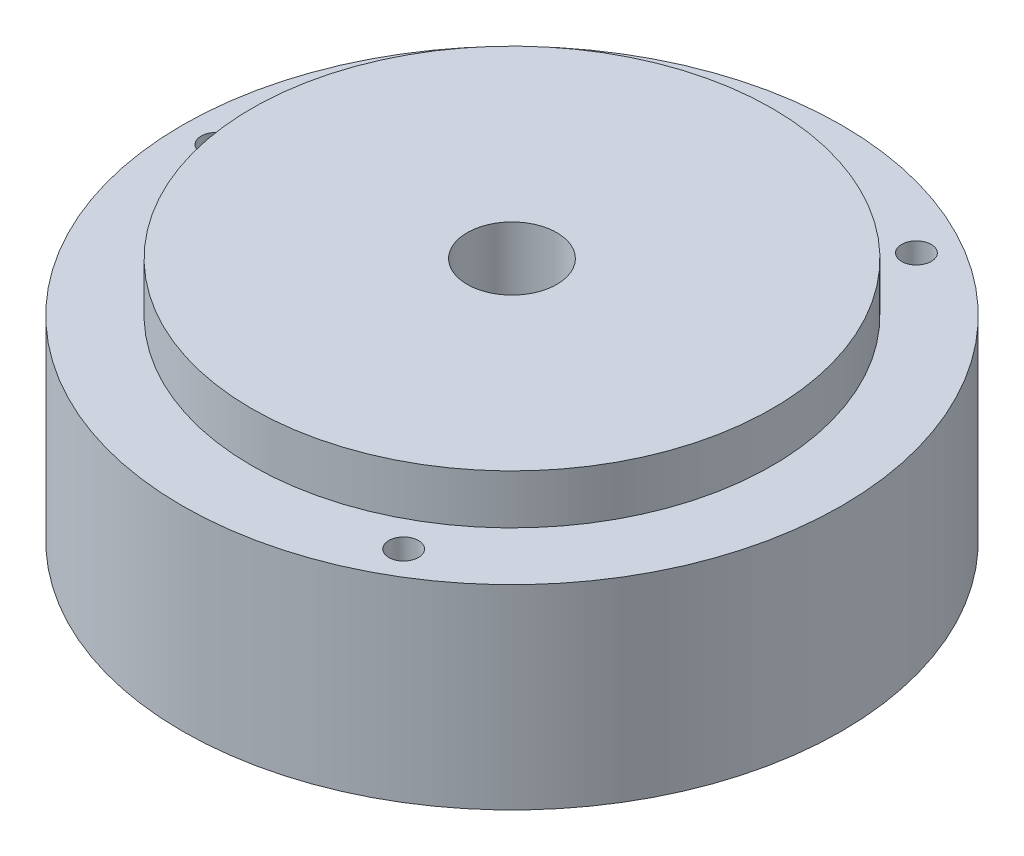
ISO-10303-21;
HEADER;
FILE_DESCRIPTION(('STEP AP214'),'2;1');
FILE_NAME('part.step','',(''),(''),'','','');
FILE_SCHEMA(('AUTOMOTIVE_DESIGN { 1 0 10303 214 1 1 1 1 }'));
ENDSEC;
DATA;
#1=APPLICATION_CONTEXT('core data for automotive mechanical design processes');
#2=APPLICATION_PROTOCOL_DEFINITION('international standard','automotive_design',2000,#1);
#3=PRODUCT_CONTEXT('',#1,'mechanical');
#4=PRODUCT('Part','Part','',(#3));
#5=PRODUCT_RELATED_PRODUCT_CATEGORY('part','',(#4));
#6=PRODUCT_DEFINITION_FORMATION('','',#4);
#7=PRODUCT_DEFINITION_CONTEXT('part definition',#1,'design');
#8=PRODUCT_DEFINITION('design','',#6,#7);
#9=PRODUCT_DEFINITION_SHAPE('','',#8);
#10=(LENGTH_UNIT() NAMED_UNIT(*) SI_UNIT(.MILLI.,.METRE.));
#11=(NAMED_UNIT(*) PLANE_ANGLE_UNIT() SI_UNIT($,.RADIAN.));
#12=(NAMED_UNIT(*) SI_UNIT($,.STERADIAN.) SOLID_ANGLE_UNIT());
#13=UNCERTAINTY_MEASURE_WITH_UNIT(LENGTH_MEASURE(1.E-05),#10,'distance_accuracy_value','');
#14=(GEOMETRIC_REPRESENTATION_CONTEXT(3) GLOBAL_UNCERTAINTY_ASSIGNED_CONTEXT((#13)) GLOBAL_UNIT_ASSIGNED_CONTEXT((#10,
#11,#12)) REPRESENTATION_CONTEXT('',''));
#15=CARTESIAN_POINT('',(0.,0.,0.));
#16=DIRECTION('',(0.,0.,1.));
#17=DIRECTION('',(1.,0.,0.));
#18=AXIS2_PLACEMENT_3D('',#15,#16,#17);
#19=CARTESIAN_POINT('',(0.,49.6219135802469,0.));
#20=DIRECTION('',(0.,1.,0.));
#21=DIRECTION('',(0.,0.,1.));
#22=AXIS2_PLACEMENT_3D('',#19,#20,#21);
#23=CYLINDRICAL_SURFACE('',#22,46.204826629932);
#24=CARTESIAN_POINT('',(0.,-19.2670480749446,0.));
#25=DIRECTION('',(0.,1.,0.));
#26=DIRECTION('',(0.,0.,1.));
#27=AXIS2_PLACEMENT_3D('',#24,#25,#26);
#28=CIRCLE('',#27,46.204826629932);
#29=CARTESIAN_POINT('',(45.8289575186259,-19.2670480749446,-5.88155223202639));
#30=VERTEX_POINT('',#29);
#31=CARTESIAN_POINT('',(5.86328891155574,-19.2670480749446,-45.8312976800973));
#32=VERTEX_POINT('',#31);
#33=EDGE_CURVE('E287',#30,#32,#28,.T.);
#34=ORIENTED_EDGE('',*,*,#33,.F.);
#35=DIRECTION('',(0.,1.,0.));
#36=VECTOR('',#35,1.);
#37=CARTESIAN_POINT('',(45.8289575186259,49.6219135802469,-5.88155223202639));
#38=LINE('',#37,#36);
#39=CARTESIAN_POINT('',(45.8289575186259,-29.7670480749446,-5.88155223202639));
#40=VERTEX_POINT('',#39);
#41=EDGE_CURVE('E153',#30,#40,#38,.F.);
#42=ORIENTED_EDGE('',*,*,#41,.T.);
#43=CARTESIAN_POINT('',(0.,-29.7670480749446,0.));
#44=DIRECTION('',(0.,1.,0.));
#45=DIRECTION('',(0.,0.,1.));
#46=AXIS2_PLACEMENT_3D('',#43,#44,#45);
#47=CIRCLE('',#46,46.204826629932);
#48=CARTESIAN_POINT('',(5.86328891155574,-29.7670480749446,-45.8312976800974));
#49=VERTEX_POINT('',#48);
#50=EDGE_CURVE('E293',#40,#49,#47,.T.);
#51=ORIENTED_EDGE('',*,*,#50,.T.);
#52=DIRECTION('',(0.,1.,0.));
#53=VECTOR('',#52,1.);
#54=CARTESIAN_POINT('',(5.86328891155574,49.6219135802469,-45.8312976800974));
#55=LINE('',#54,#53);
#56=EDGE_CURVE('E311',#49,#32,#55,.T.);
#57=ORIENTED_EDGE('',*,*,#56,.T.);
#58=EDGE_LOOP('',(#34,#42,#51,#57));
#59=FACE_BOUND('',#58,.T.);
#60=ADVANCED_FACE('F36',(#59),#23,.T.);
#61=CARTESIAN_POINT('',(5.88155223202623,-29.7670480749446,45.8289575186259));
#62=VERTEX_POINT('',#61);
#63=CARTESIAN_POINT('',(45.8312976800974,-29.7670480749446,5.86328891155526));
#64=VERTEX_POINT('',#63);
#65=EDGE_CURVE('E343',#62,#64,#47,.T.);
#66=ORIENTED_EDGE('',*,*,#65,.T.);
#67=DIRECTION('',(0.,1.,0.));
#68=VECTOR('',#67,1.);
#69=CARTESIAN_POINT('',(45.8312976800974,49.6219135802469,5.86328891155526));
#70=LINE('',#69,#68);
#71=CARTESIAN_POINT('',(45.8312976800974,-19.2670480749446,5.86328891155526));
#72=VERTEX_POINT('',#71);
#73=EDGE_CURVE('E51',#64,#72,#70,.T.);
#74=ORIENTED_EDGE('',*,*,#73,.T.);
#75=CARTESIAN_POINT('',(5.88155223202623,-19.2670480749446,45.8289575186259));
#76=VERTEX_POINT('',#75);
#77=EDGE_CURVE('E362',#76,#72,#28,.T.);
#78=ORIENTED_EDGE('',*,*,#77,.F.);
#79=DIRECTION('',(0.,1.,0.));
#80=VECTOR('',#79,1.);
#81=CARTESIAN_POINT('',(5.88155223202623,49.6219135802469,45.8289575186259));
#82=LINE('',#81,#80);
#83=EDGE_CURVE('E200',#76,#62,#82,.F.);
#84=ORIENTED_EDGE('',*,*,#83,.T.);
#85=EDGE_LOOP('',(#66,#74,#78,#84));
#86=FACE_BOUND('',#85,.T.);
#87=ADVANCED_FACE('F392',(#86),#23,.T.);
#88=CARTESIAN_POINT('',(-45.8289575186259,-29.7670480749446,5.88155223202607));
#89=VERTEX_POINT('',#88);
#90=CARTESIAN_POINT('',(-5.86328891155543,-29.7670480749446,45.8312976800974));
#91=VERTEX_POINT('',#90);
#92=EDGE_CURVE('E299',#89,#91,#47,.T.);
#93=ORIENTED_EDGE('',*,*,#92,.T.);
#94=DIRECTION('',(0.,1.,0.));
#95=VECTOR('',#94,1.);
#96=CARTESIAN_POINT('',(-5.86328891155542,49.6219135802469,45.8312976800974));
#97=LINE('',#96,#95);
#98=CARTESIAN_POINT('',(-5.86328891155542,-19.2670480749446,45.8312976800974));
#99=VERTEX_POINT('',#98);
#100=EDGE_CURVE('E58',#91,#99,#97,.T.);
#101=ORIENTED_EDGE('',*,*,#100,.T.);
#102=CARTESIAN_POINT('',(-45.8289575186259,-19.2670480749446,5.88155223202607));
#103=VERTEX_POINT('',#102);
#104=EDGE_CURVE('E294',#103,#99,#28,.T.);
#105=ORIENTED_EDGE('',*,*,#104,.F.);
#106=DIRECTION('',(0.,1.,0.));
#107=VECTOR('',#106,1.);
#108=CARTESIAN_POINT('',(-45.8289575186259,49.6219135802469,5.88155223202607));
#109=LINE('',#108,#107);
#110=EDGE_CURVE('E328',#103,#89,#109,.F.);
#111=ORIENTED_EDGE('',*,*,#110,.T.);
#112=EDGE_LOOP('',(#93,#101,#105,#111));
#113=FACE_BOUND('',#112,.T.);
#114=ADVANCED_FACE('F340',(#113),#23,.T.);
#115=CARTESIAN_POINT('',(73.5,-19.2670480749446,0.));
#116=DIRECTION('',(0.,1.,0.));
#117=DIRECTION('',(0.,0.,1.));
#118=AXIS2_PLACEMENT_3D('',#115,#116,#117);
#119=PLANE('',#118);
#120=ORIENTED_EDGE('',*,*,#77,.T.);
#121=DIRECTION('',(-1.,0.,0.));
#122=VECTOR('',#121,1.);
#123=CARTESIAN_POINT('',(46.2234515561875,-19.2670480749446,5.86328891155526));
#124=LINE('',#123,#122);
#125=CARTESIAN_POINT('',(41.0700452865314,-19.2670480749446,5.86328891155531));
#126=VERTEX_POINT('',#125);
#127=EDGE_CURVE('E157',#72,#126,#124,.T.);
#128=ORIENTED_EDGE('',*,*,#127,.T.);
#129=DIRECTION('',(0.,0.,-1.));
#130=VECTOR('',#129,1.);
#131=CARTESIAN_POINT('',(41.0700452865314,-19.2670480749446,5.86328891155531));
#132=LINE('',#131,#130);
#133=CARTESIAN_POINT('',(41.0700452865313,-19.2670480749446,-5.88155223202634));
#134=VERTEX_POINT('',#133);
#135=EDGE_CURVE('E163',#126,#134,#132,.T.);
#136=ORIENTED_EDGE('',*,*,#135,.T.);
#137=DIRECTION('',(1.,0.,0.));
#138=VECTOR('',#137,1.);
#139=CARTESIAN_POINT('',(46.2234515561874,-19.2670480749446,-5.88155223202639));
#140=LINE('',#139,#138);
#141=EDGE_CURVE('E147',#134,#30,#140,.T.);
#142=ORIENTED_EDGE('',*,*,#141,.T.);
#143=ORIENTED_EDGE('',*,*,#33,.T.);
#144=DIRECTION('',(0.,0.,1.));
#145=VECTOR('',#144,1.);
#146=CARTESIAN_POINT('',(5.86328891155574,-19.2670480749446,-46.2234515561875));
#147=LINE('',#146,#145);
#148=CARTESIAN_POINT('',(5.86328891155574,-19.2670480749446,-41.0700452865314));
#149=VERTEX_POINT('',#148);
#150=EDGE_CURVE('E234',#32,#149,#147,.T.);
#151=ORIENTED_EDGE('',*,*,#150,.T.);
#152=DIRECTION('',(-1.,0.,0.));
#153=VECTOR('',#152,1.);
#154=CARTESIAN_POINT('',(5.86328891155574,-19.2670480749446,-41.0700452865314));
#155=LINE('',#154,#153);
#156=CARTESIAN_POINT('',(-5.88155223202591,-19.2670480749446,-41.0700452865314));
#157=VERTEX_POINT('',#156);
#158=EDGE_CURVE('E226',#149,#157,#155,.T.);
#159=ORIENTED_EDGE('',*,*,#158,.T.);
#160=DIRECTION('',(0.,0.,-1.));
#161=VECTOR('',#160,1.);
#162=CARTESIAN_POINT('',(-5.88155223202591,-19.2670480749446,-46.2234515561875));
#163=LINE('',#162,#161);
#164=CARTESIAN_POINT('',(-5.88155223202591,-19.2670480749446,-45.8289575186259));
#165=VERTEX_POINT('',#164);
#166=EDGE_CURVE('E237',#157,#165,#163,.T.);
#167=ORIENTED_EDGE('',*,*,#166,.T.);
#168=CARTESIAN_POINT('',(-45.8312976800974,-19.2670480749446,-5.86328891155558));
#169=VERTEX_POINT('',#168);
#170=EDGE_CURVE('E290',#165,#169,#28,.T.);
#171=ORIENTED_EDGE('',*,*,#170,.T.);
#172=DIRECTION('',(1.,0.,0.));
#173=VECTOR('',#172,1.);
#174=CARTESIAN_POINT('',(-46.2234515561875,-19.2670480749446,-5.86328891155558));
#175=LINE('',#174,#173);
#176=CARTESIAN_POINT('',(-41.0700452865314,-19.2670480749446,-5.8632889115556));
#177=VERTEX_POINT('',#176);
#178=EDGE_CURVE('E214',#169,#177,#175,.T.);
#179=ORIENTED_EDGE('',*,*,#178,.T.);
#180=DIRECTION('',(0.,0.,1.));
#181=VECTOR('',#180,1.);
#182=CARTESIAN_POINT('',(-41.0700452865314,-19.2670480749446,-5.8632889115556));
#183=LINE('',#182,#181);
#184=CARTESIAN_POINT('',(-41.0700452865313,-19.2670480749446,5.88155223202605));
#185=VERTEX_POINT('',#184);
#186=EDGE_CURVE('E206',#177,#185,#183,.T.);
#187=ORIENTED_EDGE('',*,*,#186,.T.);
#188=DIRECTION('',(-1.,0.,0.));
#189=VECTOR('',#188,1.);
#190=CARTESIAN_POINT('',(-46.2234515561874,-19.2670480749446,5.88155223202607));
#191=LINE('',#190,#189);
#192=EDGE_CURVE('E217',#185,#103,#191,.T.);
#193=ORIENTED_EDGE('',*,*,#192,.T.);
#194=ORIENTED_EDGE('',*,*,#104,.T.);
#195=DIRECTION('',(0.,0.,-1.));
#196=VECTOR('',#195,1.);
#197=CARTESIAN_POINT('',(-5.86328891155542,-19.2670480749446,46.2234515561875));
#198=LINE('',#197,#196);
#199=CARTESIAN_POINT('',(-5.86328891155545,-19.2670480749446,41.0700452865314));
#200=VERTEX_POINT('',#199);
#201=EDGE_CURVE('E190',#99,#200,#198,.T.);
#202=ORIENTED_EDGE('',*,*,#201,.T.);
#203=DIRECTION('',(1.,0.,0.));
#204=VECTOR('',#203,1.);
#205=CARTESIAN_POINT('',(-5.86328891155545,-19.2670480749446,41.0700452865314));
#206=LINE('',#205,#204);
#207=CARTESIAN_POINT('',(5.8815522320262,-19.2670480749446,41.0700452865313));
#208=VERTEX_POINT('',#207);
#209=EDGE_CURVE('E184',#200,#208,#206,.T.);
#210=ORIENTED_EDGE('',*,*,#209,.T.);
#211=DIRECTION('',(0.,0.,1.));
#212=VECTOR('',#211,1.);
#213=CARTESIAN_POINT('',(5.88155223202623,-19.2670480749446,46.2234515561874));
#214=LINE('',#213,#212);
#215=EDGE_CURVE('E193',#208,#76,#214,.T.);
#216=ORIENTED_EDGE('',*,*,#215,.T.);
#217=EDGE_LOOP('',(#120,#128,#136,#142,#143,#151,#159,#167,#171,#179,#187,#193,#194,#202,#210,#216));
#218=FACE_BOUND('',#217,.T.);
#219=CARTESIAN_POINT('',(-66.,-19.2670480749446,0.));
#220=DIRECTION('',(0.,-1.,0.));
#221=DIRECTION('',(0.,0.,-1.));
#222=AXIS2_PLACEMENT_3D('',#219,#220,#221);
#223=CIRCLE('',#222,6.5);
#224=CARTESIAN_POINT('',(-66.,-19.2670480749446,-6.5));
#225=VERTEX_POINT('',#224);
#226=EDGE_CURVE('E243',#225,#225,#223,.T.);
#227=ORIENTED_EDGE('',*,*,#226,.F.);
#228=EDGE_LOOP('',(#227));
#229=FACE_BOUND('',#228,.T.);
#230=CARTESIAN_POINT('',(33.0000000000003,-19.2670480749446,57.1576766497728));
#231=DIRECTION('',(0.,-1.,0.));
#232=DIRECTION('',(0.,0.,-1.));
#233=AXIS2_PLACEMENT_3D('',#230,#231,#232);
#234=CIRCLE('',#233,6.5);
#235=CARTESIAN_POINT('',(33.0000000000003,-19.2670480749446,50.6576766497728));
#236=VERTEX_POINT('',#235);
#237=EDGE_CURVE('E253',#236,#236,#234,.T.);
#238=ORIENTED_EDGE('',*,*,#237,.F.);
#239=EDGE_LOOP('',(#238));
#240=FACE_BOUND('',#239,.T.);
#241=CARTESIAN_POINT('',(32.9999999999995,-19.2670480749446,-57.1576766497732));
#242=DIRECTION('',(0.,-1.,0.));
#243=DIRECTION('',(0.,0.,-1.));
#244=AXIS2_PLACEMENT_3D('',#241,#242,#243);
#245=CIRCLE('',#244,6.5);
#246=CARTESIAN_POINT('',(32.9999999999995,-19.2670480749446,-63.6576766497732));
#247=VERTEX_POINT('',#246);
#248=EDGE_CURVE('E263',#247,#247,#245,.T.);
#249=ORIENTED_EDGE('',*,*,#248,.F.);
#250=EDGE_LOOP('',(#249));
#251=FACE_BOUND('',#250,.T.);
#252=CARTESIAN_POINT('',(0.,-19.2670480749446,0.));
#253=DIRECTION('',(0.,1.,0.));
#254=DIRECTION('',(0.,0.,1.));
#255=AXIS2_PLACEMENT_3D('',#252,#253,#254);
#256=CIRCLE('',#255,73.5);
#257=CARTESIAN_POINT('',(0.,-19.2670480749446,73.5));
#258=VERTEX_POINT('',#257);
#259=EDGE_CURVE('E308',#258,#258,#256,.T.);
#260=ORIENTED_EDGE('',*,*,#259,.F.);
#261=EDGE_LOOP('',(#260));
#262=FACE_BOUND('',#261,.T.);
#263=ADVANCED_FACE('F38',(#218,#229,#240,#251,#262),#119,.F.);
#264=CARTESIAN_POINT('',(0.,49.6219135802469,0.));
#265=DIRECTION('',(0.,1.,0.));
#266=DIRECTION('',(0.,0.,1.));
#267=AXIS2_PLACEMENT_3D('',#264,#265,#266);
#268=CYLINDRICAL_SURFACE('',#267,73.5);
#269=CARTESIAN_POINT('',(0.,24.2329519250554,0.));
#270=DIRECTION('',(0.,1.,0.));
#271=DIRECTION('',(0.,0.,1.));
#272=AXIS2_PLACEMENT_3D('',#269,#270,#271);
#273=CIRCLE('',#272,73.5);
#274=CARTESIAN_POINT('',(0.,24.2329519250554,73.5));
#275=VERTEX_POINT('',#274);
#276=EDGE_CURVE('E305',#275,#275,#273,.T.);
#277=ORIENTED_EDGE('',*,*,#276,.F.);
#278=EDGE_LOOP('',(#277));
#279=FACE_BOUND('',#278,.T.);
#280=ORIENTED_EDGE('',*,*,#259,.T.);
#281=EDGE_LOOP('',(#280));
#282=FACE_BOUND('',#281,.T.);
#283=ADVANCED_FACE('F413',(#279,#282),#268,.T.);
#284=CARTESIAN_POINT('',(73.5,24.2329519250554,0.));
#285=DIRECTION('',(0.,-1.,0.));
#286=DIRECTION('',(0.,0.,-1.));
#287=AXIS2_PLACEMENT_3D('',#284,#285,#286);
#288=PLANE('',#287);
#289=CARTESIAN_POINT('',(-66.,24.2329519250554,0.));
#290=DIRECTION('',(0.,-1.,0.));
#291=DIRECTION('',(0.,0.,-1.));
#292=AXIS2_PLACEMENT_3D('',#289,#290,#291);
#293=CIRCLE('',#292,3.3);
#294=CARTESIAN_POINT('',(-66.,24.2329519250554,-3.3));
#295=VERTEX_POINT('',#294);
#296=EDGE_CURVE('E252',#295,#295,#293,.T.);
#297=ORIENTED_EDGE('',*,*,#296,.T.);
#298=EDGE_LOOP('',(#297));
#299=FACE_BOUND('',#298,.T.);
#300=CARTESIAN_POINT('',(33.0000000000003,24.2329519250554,57.1576766497728));
#301=DIRECTION('',(0.,-1.,0.));
#302=DIRECTION('',(0.,0.,-1.));
#303=AXIS2_PLACEMENT_3D('',#300,#301,#302);
#304=CIRCLE('',#303,3.29999999999999);
#305=CARTESIAN_POINT('',(33.0000000000003,24.2329519250554,53.8576766497728));
#306=VERTEX_POINT('',#305);
#307=EDGE_CURVE('E262',#306,#306,#304,.T.);
#308=ORIENTED_EDGE('',*,*,#307,.T.);
#309=EDGE_LOOP('',(#308));
#310=FACE_BOUND('',#309,.T.);
#311=CARTESIAN_POINT('',(32.9999999999995,24.2329519250554,-57.1576766497732));
#312=DIRECTION('',(0.,-1.,0.));
#313=DIRECTION('',(0.,0.,-1.));
#314=AXIS2_PLACEMENT_3D('',#311,#312,#313);
#315=CIRCLE('',#314,3.29999999999999);
#316=CARTESIAN_POINT('',(32.9999999999995,24.2329519250554,-60.4576766497732));
#317=VERTEX_POINT('',#316);
#318=EDGE_CURVE('E272',#317,#317,#315,.T.);
#319=ORIENTED_EDGE('',*,*,#318,.T.);
#320=EDGE_LOOP('',(#319));
#321=FACE_BOUND('',#320,.T.);
#322=CARTESIAN_POINT('',(0.,24.2329519250554,0.));
#323=DIRECTION('',(0.,1.,0.));
#324=DIRECTION('',(0.,0.,1.));
#325=AXIS2_PLACEMENT_3D('',#322,#323,#324);
#326=CIRCLE('',#325,58.);
#327=CARTESIAN_POINT('',(0.,24.2329519250554,58.));
#328=VERTEX_POINT('',#327);
#329=EDGE_CURVE('E302',#328,#328,#326,.T.);
#330=ORIENTED_EDGE('',*,*,#329,.F.);
#331=EDGE_LOOP('',(#330));
#332=FACE_BOUND('',#331,.T.);
#333=ORIENTED_EDGE('',*,*,#276,.T.);
#334=EDGE_LOOP('',(#333));
#335=FACE_BOUND('',#334,.T.);
#336=ADVANCED_FACE('F417',(#299,#310,#321,#332,#335),#288,.F.);
#337=CARTESIAN_POINT('',(0.,49.6219135802469,0.));
#338=DIRECTION('',(0.,1.,0.));
#339=DIRECTION('',(0.,0.,1.));
#340=AXIS2_PLACEMENT_3D('',#337,#338,#339);
#341=CYLINDRICAL_SURFACE('',#340,58.);
#342=CARTESIAN_POINT('',(0.,35.2329519250554,0.));
#343=DIRECTION('',(0.,1.,0.));
#344=DIRECTION('',(0.,0.,1.));
#345=AXIS2_PLACEMENT_3D('',#342,#343,#344);
#346=CIRCLE('',#345,58.);
#347=CARTESIAN_POINT('',(0.,35.2329519250554,58.));
#348=VERTEX_POINT('',#347);
#349=EDGE_CURVE('E298',#348,#348,#346,.T.);
#350=ORIENTED_EDGE('',*,*,#349,.F.);
#351=EDGE_LOOP('',(#350));
#352=FACE_BOUND('',#351,.T.);
#353=ORIENTED_EDGE('',*,*,#329,.T.);
#354=EDGE_LOOP('',(#353));
#355=FACE_BOUND('',#354,.T.);
#356=ADVANCED_FACE('F422',(#352,#355),#341,.T.);
#357=CARTESIAN_POINT('',(58.,35.2329519250554,0.));
#358=DIRECTION('',(0.,-1.,0.));
#359=DIRECTION('',(0.,0.,-1.));
#360=AXIS2_PLACEMENT_3D('',#357,#358,#359);
#361=PLANE('',#360);
#362=CARTESIAN_POINT('',(0.,35.2329519250554,0.));
#363=DIRECTION('',(0.,1.,0.));
#364=DIRECTION('',(0.,0.,1.));
#365=AXIS2_PLACEMENT_3D('',#362,#363,#364);
#366=CIRCLE('',#365,10.);
#367=CARTESIAN_POINT('',(0.,35.2329519250554,10.));
#368=VERTEX_POINT('',#367);
#369=EDGE_CURVE('E281',#368,#368,#366,.T.);
#370=ORIENTED_EDGE('',*,*,#369,.F.);
#371=EDGE_LOOP('',(#370));
#372=FACE_BOUND('',#371,.T.);
#373=ORIENTED_EDGE('',*,*,#349,.T.);
#374=EDGE_LOOP('',(#373));
#375=FACE_BOUND('',#374,.T.);
#376=ADVANCED_FACE('F407',(#372,#375),#361,.F.);
#377=CARTESIAN_POINT('',(46.204826629932,-29.7670480749446,0.));
#378=DIRECTION('',(0.,1.,0.));
#379=DIRECTION('',(0.,0.,1.));
#380=AXIS2_PLACEMENT_3D('',#377,#378,#379);
#381=PLANE('',#380);
#382=CARTESIAN_POINT('',(0.,-29.7670480749446,0.));
#383=DIRECTION('',(0.,-1.,0.));
#384=DIRECTION('',(0.,0.,-1.));
#385=AXIS2_PLACEMENT_3D('',#382,#383,#384);
#386=CIRCLE('',#385,20.);
#387=CARTESIAN_POINT('',(0.,-29.7670480749446,-20.));
#388=VERTEX_POINT('',#387);
#389=EDGE_CURVE('E276',#388,#388,#386,.T.);
#390=ORIENTED_EDGE('',*,*,#389,.F.);
#391=EDGE_LOOP('',(#390));
#392=FACE_BOUND('',#391,.T.);
#393=ORIENTED_EDGE('',*,*,#50,.F.);
#394=DIRECTION('',(1.,0.,0.));
#395=VECTOR('',#394,1.);
#396=CARTESIAN_POINT('',(46.2234515561874,-29.7670480749446,-5.88155223202639));
#397=LINE('',#396,#395);
#398=CARTESIAN_POINT('',(41.0700452865313,-29.7670480749446,-5.88155223202634));
#399=VERTEX_POINT('',#398);
#400=EDGE_CURVE('E171',#399,#40,#397,.T.);
#401=ORIENTED_EDGE('',*,*,#400,.F.);
#402=DIRECTION('',(0.,0.,-1.));
#403=VECTOR('',#402,1.);
#404=CARTESIAN_POINT('',(41.0700452865314,-29.7670480749446,5.86328891155531));
#405=LINE('',#404,#403);
#406=CARTESIAN_POINT('',(41.0700452865314,-29.7670480749446,5.86328891155531));
#407=VERTEX_POINT('',#406);
#408=EDGE_CURVE('E166',#407,#399,#405,.T.);
#409=ORIENTED_EDGE('',*,*,#408,.F.);
#410=DIRECTION('',(1.,0.,0.));
#411=VECTOR('',#410,1.);
#412=CARTESIAN_POINT('',(46.204826629932,-29.7670480749446,5.86328891155526));
#413=LINE('',#412,#411);
#414=EDGE_CURVE('E11',#407,#64,#413,.T.);
#415=ORIENTED_EDGE('',*,*,#414,.T.);
#416=ORIENTED_EDGE('',*,*,#65,.F.);
#417=DIRECTION('',(0.,0.,1.));
#418=VECTOR('',#417,1.);
#419=CARTESIAN_POINT('',(5.88155223202623,-29.7670480749446,46.2234515561874));
#420=LINE('',#419,#418);
#421=CARTESIAN_POINT('',(5.8815522320262,-29.7670480749446,41.0700452865313));
#422=VERTEX_POINT('',#421);
#423=EDGE_CURVE('E182',#422,#62,#420,.T.);
#424=ORIENTED_EDGE('',*,*,#423,.F.);
#425=DIRECTION('',(1.,0.,0.));
#426=VECTOR('',#425,1.);
#427=CARTESIAN_POINT('',(-5.86328891155545,-29.7670480749446,41.0700452865314));
#428=LINE('',#427,#426);
#429=CARTESIAN_POINT('',(-5.86328891155545,-29.7670480749446,41.0700452865314));
#430=VERTEX_POINT('',#429);
#431=EDGE_CURVE('E181',#430,#422,#428,.T.);
#432=ORIENTED_EDGE('',*,*,#431,.F.);
#433=DIRECTION('',(0.,0.,1.));
#434=VECTOR('',#433,1.);
#435=CARTESIAN_POINT('',(-5.86328891155574,-29.7670480749446,3.59303622089015E-13));
#436=LINE('',#435,#434);
#437=EDGE_CURVE('E44',#430,#91,#436,.T.);
#438=ORIENTED_EDGE('',*,*,#437,.T.);
#439=ORIENTED_EDGE('',*,*,#92,.F.);
#440=DIRECTION('',(-1.,0.,0.));
#441=VECTOR('',#440,1.);
#442=CARTESIAN_POINT('',(-46.2234515561874,-29.7670480749446,5.88155223202607));
#443=LINE('',#442,#441);
#444=CARTESIAN_POINT('',(-41.0700452865313,-29.7670480749446,5.88155223202605));
#445=VERTEX_POINT('',#444);
#446=EDGE_CURVE('E204',#445,#89,#443,.T.);
#447=ORIENTED_EDGE('',*,*,#446,.F.);
#448=DIRECTION('',(0.,0.,1.));
#449=VECTOR('',#448,1.);
#450=CARTESIAN_POINT('',(-41.0700452865314,-29.7670480749446,-5.8632889115556));
#451=LINE('',#450,#449);
#452=CARTESIAN_POINT('',(-41.0700452865314,-29.7670480749446,-5.8632889115556));
#453=VERTEX_POINT('',#452);
#454=EDGE_CURVE('E207',#453,#445,#451,.T.);
#455=ORIENTED_EDGE('',*,*,#454,.F.);
#456=DIRECTION('',(1.,0.,0.));
#457=VECTOR('',#456,1.);
#458=CARTESIAN_POINT('',(-46.2234515561875,-29.7670480749446,-5.86328891155558));
#459=LINE('',#458,#457);
#460=CARTESIAN_POINT('',(-45.8312976800974,-29.7670480749446,-5.86328891155558));
#461=VERTEX_POINT('',#460);
#462=EDGE_CURVE('E203',#461,#453,#459,.T.);
#463=ORIENTED_EDGE('',*,*,#462,.F.);
#464=CARTESIAN_POINT('',(-5.88155223202591,-29.7670480749446,-45.8289575186259));
#465=VERTEX_POINT('',#464);
#466=EDGE_CURVE('E295',#465,#461,#47,.T.);
#467=ORIENTED_EDGE('',*,*,#466,.F.);
#468=DIRECTION('',(0.,0.,-1.));
#469=VECTOR('',#468,1.);
#470=CARTESIAN_POINT('',(-5.88155223202591,-29.7670480749446,-46.2234515561875));
#471=LINE('',#470,#469);
#472=CARTESIAN_POINT('',(-5.88155223202591,-29.7670480749446,-41.0700452865314));
#473=VERTEX_POINT('',#472);
#474=EDGE_CURVE('E224',#473,#465,#471,.T.);
#475=ORIENTED_EDGE('',*,*,#474,.F.);
#476=DIRECTION('',(-1.,0.,0.));
#477=VECTOR('',#476,1.);
#478=CARTESIAN_POINT('',(5.86328891155574,-29.7670480749446,-41.0700452865314));
#479=LINE('',#478,#477);
#480=CARTESIAN_POINT('',(5.86328891155574,-29.7670480749446,-41.0700452865314));
#481=VERTEX_POINT('',#480);
#482=EDGE_CURVE('E227',#481,#473,#479,.T.);
#483=ORIENTED_EDGE('',*,*,#482,.F.);
#484=DIRECTION('',(0.,0.,1.));
#485=VECTOR('',#484,1.);
#486=CARTESIAN_POINT('',(5.86328891155574,-29.7670480749446,-46.2234515561875));
#487=LINE('',#486,#485);
#488=EDGE_CURVE('E223',#49,#481,#487,.T.);
#489=ORIENTED_EDGE('',*,*,#488,.F.);
#490=EDGE_LOOP('',(#393,#401,#409,#415,#416,#424,#432,#438,#439,#447,#455,#463,#467,#475,#483,#489));
#491=FACE_BOUND('',#490,.T.);
#492=ADVANCED_FACE('F335',(#392,#491),#381,.F.);
#493=ORIENTED_EDGE('',*,*,#466,.T.);
#494=DIRECTION('',(0.,1.,0.));
#495=VECTOR('',#494,1.);
#496=CARTESIAN_POINT('',(-45.8312976800974,49.6219135802469,-5.86328891155558));
#497=LINE('',#496,#495);
#498=EDGE_CURVE('E325',#461,#169,#497,.T.);
#499=ORIENTED_EDGE('',*,*,#498,.T.);
#500=ORIENTED_EDGE('',*,*,#170,.F.);
#501=DIRECTION('',(0.,1.,0.));
#502=VECTOR('',#501,1.);
#503=CARTESIAN_POINT('',(-5.88155223202591,49.6219135802469,-45.8289575186259));
#504=LINE('',#503,#502);
#505=EDGE_CURVE('E322',#165,#465,#504,.F.);
#506=ORIENTED_EDGE('',*,*,#505,.T.);
#507=EDGE_LOOP('',(#493,#499,#500,#506));
#508=FACE_BOUND('',#507,.T.);
#509=ADVANCED_FACE('F376',(#508),#23,.T.);
#510=CARTESIAN_POINT('',(0.,10.2329519250554,0.));
#511=DIRECTION('',(0.,1.,0.));
#512=DIRECTION('',(0.,0.,1.));
#513=AXIS2_PLACEMENT_3D('',#510,#511,#512);
#514=CYLINDRICAL_SURFACE('',#513,10.);
#515=CARTESIAN_POINT('',(0.,10.2329519250554,0.));
#516=DIRECTION('',(0.,1.,0.));
#517=DIRECTION('',(0.,0.,1.));
#518=AXIS2_PLACEMENT_3D('',#515,#516,#517);
#519=CIRCLE('',#518,10.);
#520=CARTESIAN_POINT('',(0.,10.2329519250554,10.));
#521=VERTEX_POINT('',#520);
#522=EDGE_CURVE('E284',#521,#521,#519,.T.);
#523=ORIENTED_EDGE('',*,*,#522,.F.);
#524=EDGE_LOOP('',(#523));
#525=FACE_BOUND('',#524,.T.);
#526=ORIENTED_EDGE('',*,*,#369,.T.);
#527=EDGE_LOOP('',(#526));
#528=FACE_BOUND('',#527,.T.);
#529=ADVANCED_FACE('F400',(#525,#528),#514,.F.);
#530=CARTESIAN_POINT('',(0.,10.2329519250554,0.));
#531=DIRECTION('',(0.,1.,0.));
#532=DIRECTION('',(0.,0.,1.));
#533=AXIS2_PLACEMENT_3D('',#530,#531,#532);
#534=PLANE('',#533);
#535=CARTESIAN_POINT('',(0.,10.2329519250554,0.));
#536=DIRECTION('',(0.,1.,0.));
#537=DIRECTION('',(0.,0.,1.));
#538=AXIS2_PLACEMENT_3D('',#535,#536,#537);
#539=CIRCLE('',#538,3.3);
#540=CARTESIAN_POINT('',(0.,10.2329519250554,3.29999999999999));
#541=VERTEX_POINT('',#540);
#542=EDGE_CURVE('E273',#541,#541,#539,.T.);
#543=ORIENTED_EDGE('',*,*,#542,.F.);
#544=EDGE_LOOP('',(#543));
#545=FACE_BOUND('',#544,.T.);
#546=ORIENTED_EDGE('',*,*,#522,.T.);
#547=EDGE_LOOP('',(#546));
#548=FACE_BOUND('',#547,.T.);
#549=ADVANCED_FACE('F405',(#545,#548),#534,.T.);
#550=CARTESIAN_POINT('',(0.,-11.7670480749446,0.));
#551=DIRECTION('',(0.,-1.,0.));
#552=DIRECTION('',(0.,0.,-1.));
#553=AXIS2_PLACEMENT_3D('',#550,#551,#552);
#554=CYLINDRICAL_SURFACE('',#553,20.);
#555=CARTESIAN_POINT('',(0.,-11.7670480749446,0.));
#556=DIRECTION('',(0.,-1.,0.));
#557=DIRECTION('',(0.,0.,-1.));
#558=AXIS2_PLACEMENT_3D('',#555,#556,#557);
#559=CIRCLE('',#558,20.);
#560=CARTESIAN_POINT('',(0.,-11.7670480749446,-20.));
#561=VERTEX_POINT('',#560);
#562=EDGE_CURVE('E278',#561,#561,#559,.T.);
#563=ORIENTED_EDGE('',*,*,#562,.F.);
#564=EDGE_LOOP('',(#563));
#565=FACE_BOUND('',#564,.T.);
#566=ORIENTED_EDGE('',*,*,#389,.T.);
#567=EDGE_LOOP('',(#566));
#568=FACE_BOUND('',#567,.T.);
#569=ADVANCED_FACE('F597',(#565,#568),#554,.F.);
#570=CARTESIAN_POINT('',(0.,-11.7670480749446,0.));
#571=DIRECTION('',(0.,-1.,0.));
#572=DIRECTION('',(0.,0.,-1.));
#573=AXIS2_PLACEMENT_3D('',#570,#571,#572);
#574=PLANE('',#573);
#575=CARTESIAN_POINT('',(0.,-11.7670480749446,0.));
#576=DIRECTION('',(0.,-1.,0.));
#577=DIRECTION('',(0.,0.,-1.));
#578=AXIS2_PLACEMENT_3D('',#575,#576,#577);
#579=CIRCLE('',#578,3.3);
#580=CARTESIAN_POINT('',(0.,-11.7670480749446,-3.3));
#581=VERTEX_POINT('',#580);
#582=EDGE_CURVE('E277',#581,#581,#579,.T.);
#583=ORIENTED_EDGE('',*,*,#582,.F.);
#584=EDGE_LOOP('',(#583));
#585=FACE_BOUND('',#584,.T.);
#586=ORIENTED_EDGE('',*,*,#562,.T.);
#587=EDGE_LOOP('',(#586));
#588=FACE_BOUND('',#587,.T.);
#589=ADVANCED_FACE('F593',(#585,#588),#574,.T.);
#590=CARTESIAN_POINT('',(0.,-19.2670480749446,0.));
#591=DIRECTION('',(0.,-1.,0.));
#592=DIRECTION('',(0.,0.,-1.));
#593=AXIS2_PLACEMENT_3D('',#590,#591,#592);
#594=CYLINDRICAL_SURFACE('',#593,3.3);
#595=ORIENTED_EDGE('',*,*,#542,.T.);
#596=EDGE_LOOP('',(#595));
#597=FACE_BOUND('',#596,.T.);
#598=ORIENTED_EDGE('',*,*,#582,.T.);
#599=EDGE_LOOP('',(#598));
#600=FACE_BOUND('',#599,.T.);
#601=ADVANCED_FACE('F589',(#597,#600),#594,.F.);
#602=CARTESIAN_POINT('',(32.9999999999995,-19.2670480749446,-57.1576766497732));
#603=DIRECTION('',(0.,-1.,0.));
#604=DIRECTION('',(0.,0.,-1.));
#605=AXIS2_PLACEMENT_3D('',#602,#603,#604);
#606=CYLINDRICAL_SURFACE('',#605,3.29999999999999);
#607=CARTESIAN_POINT('',(32.9999999999995,-14.6670480749446,-57.1576766497732));
#608=DIRECTION('',(0.,-1.,0.));
#609=DIRECTION('',(0.,0.,-1.));
#610=AXIS2_PLACEMENT_3D('',#607,#608,#609);
#611=CIRCLE('',#610,3.3);
#612=CARTESIAN_POINT('',(32.9999999999995,-14.6670480749446,-60.4576766497732));
#613=VERTEX_POINT('',#612);
#614=EDGE_CURVE('E269',#613,#613,#611,.T.);
#615=ORIENTED_EDGE('',*,*,#614,.T.);
#616=EDGE_LOOP('',(#615));
#617=FACE_BOUND('',#616,.T.);
#618=ORIENTED_EDGE('',*,*,#318,.F.);
#619=EDGE_LOOP('',(#618));
#620=FACE_BOUND('',#619,.T.);
#621=ADVANCED_FACE('F585',(#617,#620),#606,.F.);
#622=CARTESIAN_POINT('',(36.2999999999995,-14.6670480749446,-57.1576766497732));
#623=DIRECTION('',(0.,1.,0.));
#624=DIRECTION('',(0.,0.,1.));
#625=AXIS2_PLACEMENT_3D('',#622,#623,#624);
#626=PLANE('',#625);
#627=ORIENTED_EDGE('',*,*,#614,.F.);
#628=EDGE_LOOP('',(#627));
#629=FACE_BOUND('',#628,.T.);
#630=CARTESIAN_POINT('',(32.9999999999995,-14.6670480749446,-57.1576766497732));
#631=DIRECTION('',(0.,-1.,0.));
#632=DIRECTION('',(0.,0.,-1.));
#633=AXIS2_PLACEMENT_3D('',#630,#631,#632);
#634=CIRCLE('',#633,6.5);
#635=CARTESIAN_POINT('',(32.9999999999995,-14.6670480749446,-63.6576766497732));
#636=VERTEX_POINT('',#635);
#637=EDGE_CURVE('E266',#636,#636,#634,.T.);
#638=ORIENTED_EDGE('',*,*,#637,.T.);
#639=EDGE_LOOP('',(#638));
#640=FACE_BOUND('',#639,.T.);
#641=ADVANCED_FACE('F581',(#629,#640),#626,.F.);
#642=CARTESIAN_POINT('',(32.9999999999995,-19.2670480749446,-57.1576766497732));
#643=DIRECTION('',(0.,-1.,0.));
#644=DIRECTION('',(0.,0.,-1.));
#645=AXIS2_PLACEMENT_3D('',#642,#643,#644);
#646=CYLINDRICAL_SURFACE('',#645,6.5);
#647=ORIENTED_EDGE('',*,*,#637,.F.);
#648=EDGE_LOOP('',(#647));
#649=FACE_BOUND('',#648,.T.);
#650=ORIENTED_EDGE('',*,*,#248,.T.);
#651=EDGE_LOOP('',(#650));
#652=FACE_BOUND('',#651,.T.);
#653=ADVANCED_FACE('F577',(#649,#652),#646,.F.);
#654=CARTESIAN_POINT('',(33.0000000000003,-19.2670480749446,57.1576766497728));
#655=DIRECTION('',(0.,-1.,0.));
#656=DIRECTION('',(0.,0.,-1.));
#657=AXIS2_PLACEMENT_3D('',#654,#655,#656);
#658=CYLINDRICAL_SURFACE('',#657,3.29999999999999);
#659=CARTESIAN_POINT('',(33.0000000000003,-14.6670480749446,57.1576766497728));
#660=DIRECTION('',(0.,-1.,0.));
#661=DIRECTION('',(0.,0.,-1.));
#662=AXIS2_PLACEMENT_3D('',#659,#660,#661);
#663=CIRCLE('',#662,3.3);
#664=CARTESIAN_POINT('',(33.0000000000003,-14.6670480749446,53.8576766497728));
#665=VERTEX_POINT('',#664);
#666=EDGE_CURVE('E259',#665,#665,#663,.T.);
#667=ORIENTED_EDGE('',*,*,#666,.T.);
#668=EDGE_LOOP('',(#667));
#669=FACE_BOUND('',#668,.T.);
#670=ORIENTED_EDGE('',*,*,#307,.F.);
#671=EDGE_LOOP('',(#670));
#672=FACE_BOUND('',#671,.T.);
#673=ADVANCED_FACE('F573',(#669,#672),#658,.F.);
#674=CARTESIAN_POINT('',(36.3000000000003,-14.6670480749446,57.1576766497728));
#675=DIRECTION('',(0.,1.,0.));
#676=DIRECTION('',(0.,0.,1.));
#677=AXIS2_PLACEMENT_3D('',#674,#675,#676);
#678=PLANE('',#677);
#679=ORIENTED_EDGE('',*,*,#666,.F.);
#680=EDGE_LOOP('',(#679));
#681=FACE_BOUND('',#680,.T.);
#682=CARTESIAN_POINT('',(33.0000000000003,-14.6670480749446,57.1576766497728));
#683=DIRECTION('',(0.,-1.,0.));
#684=DIRECTION('',(0.,0.,-1.));
#685=AXIS2_PLACEMENT_3D('',#682,#683,#684);
#686=CIRCLE('',#685,6.5);
#687=CARTESIAN_POINT('',(33.0000000000003,-14.6670480749446,50.6576766497728));
#688=VERTEX_POINT('',#687);
#689=EDGE_CURVE('E256',#688,#688,#686,.T.);
#690=ORIENTED_EDGE('',*,*,#689,.T.);
#691=EDGE_LOOP('',(#690));
#692=FACE_BOUND('',#691,.T.);
#693=ADVANCED_FACE('F569',(#681,#692),#678,.F.);
#694=CARTESIAN_POINT('',(33.0000000000003,-19.2670480749446,57.1576766497728));
#695=DIRECTION('',(0.,-1.,0.));
#696=DIRECTION('',(0.,0.,-1.));
#697=AXIS2_PLACEMENT_3D('',#694,#695,#696);
#698=CYLINDRICAL_SURFACE('',#697,6.5);
#699=ORIENTED_EDGE('',*,*,#689,.F.);
#700=EDGE_LOOP('',(#699));
#701=FACE_BOUND('',#700,.T.);
#702=ORIENTED_EDGE('',*,*,#237,.T.);
#703=EDGE_LOOP('',(#702));
#704=FACE_BOUND('',#703,.T.);
#705=ADVANCED_FACE('F565',(#701,#704),#698,.F.);
#706=CARTESIAN_POINT('',(-66.,-19.2670480749446,0.));
#707=DIRECTION('',(0.,-1.,0.));
#708=DIRECTION('',(0.,0.,-1.));
#709=AXIS2_PLACEMENT_3D('',#706,#707,#708);
#710=CYLINDRICAL_SURFACE('',#709,3.3);
#711=CARTESIAN_POINT('',(-66.,-14.6670480749446,0.));
#712=DIRECTION('',(0.,-1.,0.));
#713=DIRECTION('',(0.,0.,-1.));
#714=AXIS2_PLACEMENT_3D('',#711,#712,#713);
#715=CIRCLE('',#714,3.30000000000001);
#716=CARTESIAN_POINT('',(-66.,-14.6670480749446,-3.30000000000001));
#717=VERTEX_POINT('',#716);
#718=EDGE_CURVE('E249',#717,#717,#715,.T.);
#719=ORIENTED_EDGE('',*,*,#718,.T.);
#720=EDGE_LOOP('',(#719));
#721=FACE_BOUND('',#720,.T.);
#722=ORIENTED_EDGE('',*,*,#296,.F.);
#723=EDGE_LOOP('',(#722));
#724=FACE_BOUND('',#723,.T.);
#725=ADVANCED_FACE('F561',(#721,#724),#710,.F.);
#726=CARTESIAN_POINT('',(-62.7,-14.6670480749446,0.));
#727=DIRECTION('',(0.,1.,0.));
#728=DIRECTION('',(0.,0.,1.));
#729=AXIS2_PLACEMENT_3D('',#726,#727,#728);
#730=PLANE('',#729);
#731=ORIENTED_EDGE('',*,*,#718,.F.);
#732=EDGE_LOOP('',(#731));
#733=FACE_BOUND('',#732,.T.);
#734=CARTESIAN_POINT('',(-66.,-14.6670480749446,0.));
#735=DIRECTION('',(0.,-1.,0.));
#736=DIRECTION('',(0.,0.,-1.));
#737=AXIS2_PLACEMENT_3D('',#734,#735,#736);
#738=CIRCLE('',#737,6.5);
#739=CARTESIAN_POINT('',(-66.,-14.6670480749446,-6.5));
#740=VERTEX_POINT('',#739);
#741=EDGE_CURVE('E246',#740,#740,#738,.T.);
#742=ORIENTED_EDGE('',*,*,#741,.T.);
#743=EDGE_LOOP('',(#742));
#744=FACE_BOUND('',#743,.T.);
#745=ADVANCED_FACE('F387',(#733,#744),#730,.F.);
#746=CARTESIAN_POINT('',(-66.,-19.2670480749446,0.));
#747=DIRECTION('',(0.,-1.,0.));
#748=DIRECTION('',(0.,0.,-1.));
#749=AXIS2_PLACEMENT_3D('',#746,#747,#748);
#750=CYLINDRICAL_SURFACE('',#749,6.5);
#751=ORIENTED_EDGE('',*,*,#741,.F.);
#752=EDGE_LOOP('',(#751));
#753=FACE_BOUND('',#752,.T.);
#754=ORIENTED_EDGE('',*,*,#226,.T.);
#755=EDGE_LOOP('',(#754));
#756=FACE_BOUND('',#755,.T.);
#757=ADVANCED_FACE('F380',(#753,#756),#750,.F.);
#758=CARTESIAN_POINT('',(-5.88155223202591,-6.44133602188094,-46.2234515561875));
#759=DIRECTION('',(-1.,0.,0.));
#760=DIRECTION('',(0.,0.,1.));
#761=AXIS2_PLACEMENT_3D('',#758,#759,#760);
#762=PLANE('',#761);
#763=ORIENTED_EDGE('',*,*,#166,.F.);
#764=DIRECTION('',(0.,-1.,0.));
#765=VECTOR('',#764,1.);
#766=CARTESIAN_POINT('',(-5.88155223202591,-6.44133602188094,-41.0700452865314));
#767=LINE('',#766,#765);
#768=EDGE_CURVE('E233',#157,#473,#767,.T.);
#769=ORIENTED_EDGE('',*,*,#768,.T.);
#770=ORIENTED_EDGE('',*,*,#474,.T.);
#771=ORIENTED_EDGE('',*,*,#505,.F.);
#772=EDGE_LOOP('',(#763,#769,#770,#771));
#773=FACE_BOUND('',#772,.T.);
#774=ADVANCED_FACE('F378',(#773),#762,.F.);
#775=CARTESIAN_POINT('',(5.86328891155574,-6.44133602188094,-46.2234515561875));
#776=DIRECTION('',(1.,0.,0.));
#777=DIRECTION('',(0.,0.,-1.));
#778=AXIS2_PLACEMENT_3D('',#775,#776,#777);
#779=PLANE('',#778);
#780=ORIENTED_EDGE('',*,*,#488,.T.);
#781=DIRECTION('',(0.,-1.,0.));
#782=VECTOR('',#781,1.);
#783=CARTESIAN_POINT('',(5.86328891155574,-6.44133602188094,-41.0700452865314));
#784=LINE('',#783,#782);
#785=EDGE_CURVE('E236',#149,#481,#784,.T.);
#786=ORIENTED_EDGE('',*,*,#785,.F.);
#787=ORIENTED_EDGE('',*,*,#150,.F.);
#788=ORIENTED_EDGE('',*,*,#56,.F.);
#789=EDGE_LOOP('',(#780,#786,#787,#788));
#790=FACE_BOUND('',#789,.T.);
#791=ADVANCED_FACE('F352',(#790),#779,.F.);
#792=CARTESIAN_POINT('',(5.86328891155574,-6.44133602188094,-41.0700452865314));
#793=DIRECTION('',(0.,0.,1.));
#794=DIRECTION('',(1.,0.,0.));
#795=AXIS2_PLACEMENT_3D('',#792,#793,#794);
#796=PLANE('',#795);
#797=ORIENTED_EDGE('',*,*,#785,.T.);
#798=ORIENTED_EDGE('',*,*,#482,.T.);
#799=ORIENTED_EDGE('',*,*,#768,.F.);
#800=ORIENTED_EDGE('',*,*,#158,.F.);
#801=EDGE_LOOP('',(#797,#798,#799,#800));
#802=FACE_BOUND('',#801,.T.);
#803=ADVANCED_FACE('F359',(#802),#796,.F.);
#804=CARTESIAN_POINT('',(-46.2234515561874,-6.44133602188094,5.88155223202607));
#805=DIRECTION('',(0.,0.,1.));
#806=DIRECTION('',(1.,0.,0.));
#807=AXIS2_PLACEMENT_3D('',#804,#805,#806);
#808=PLANE('',#807);
#809=ORIENTED_EDGE('',*,*,#192,.F.);
#810=DIRECTION('',(0.,-1.,0.));
#811=VECTOR('',#810,1.);
#812=CARTESIAN_POINT('',(-41.0700452865313,-6.44133602188094,5.88155223202605));
#813=LINE('',#812,#811);
#814=EDGE_CURVE('E213',#185,#445,#813,.T.);
#815=ORIENTED_EDGE('',*,*,#814,.T.);
#816=ORIENTED_EDGE('',*,*,#446,.T.);
#817=ORIENTED_EDGE('',*,*,#110,.F.);
#818=EDGE_LOOP('',(#809,#815,#816,#817));
#819=FACE_BOUND('',#818,.T.);
#820=ADVANCED_FACE('F368',(#819),#808,.F.);
#821=CARTESIAN_POINT('',(-46.2234515561875,-6.44133602188094,-5.86328891155558));
#822=DIRECTION('',(0.,0.,-1.));
#823=DIRECTION('',(-1.,0.,0.));
#824=AXIS2_PLACEMENT_3D('',#821,#822,#823);
#825=PLANE('',#824);
#826=ORIENTED_EDGE('',*,*,#462,.T.);
#827=DIRECTION('',(0.,-1.,0.));
#828=VECTOR('',#827,1.);
#829=CARTESIAN_POINT('',(-41.0700452865314,-6.44133602188094,-5.8632889115556));
#830=LINE('',#829,#828);
#831=EDGE_CURVE('E216',#177,#453,#830,.T.);
#832=ORIENTED_EDGE('',*,*,#831,.F.);
#833=ORIENTED_EDGE('',*,*,#178,.F.);
#834=ORIENTED_EDGE('',*,*,#498,.F.);
#835=EDGE_LOOP('',(#826,#832,#833,#834));
#836=FACE_BOUND('',#835,.T.);
#837=ADVANCED_FACE('F483',(#836),#825,.F.);
#838=CARTESIAN_POINT('',(-41.0700452865314,-6.44133602188094,-5.8632889115556));
#839=DIRECTION('',(1.,0.,0.));
#840=DIRECTION('',(0.,0.,-1.));
#841=AXIS2_PLACEMENT_3D('',#838,#839,#840);
#842=PLANE('',#841);
#843=ORIENTED_EDGE('',*,*,#831,.T.);
#844=ORIENTED_EDGE('',*,*,#454,.T.);
#845=ORIENTED_EDGE('',*,*,#814,.F.);
#846=ORIENTED_EDGE('',*,*,#186,.F.);
#847=EDGE_LOOP('',(#843,#844,#845,#846));
#848=FACE_BOUND('',#847,.T.);
#849=ADVANCED_FACE('F370',(#848),#842,.F.);
#850=CARTESIAN_POINT('',(5.88155223202623,-6.44133602188094,46.2234515561874));
#851=DIRECTION('',(1.,0.,0.));
#852=DIRECTION('',(0.,0.,-1.));
#853=AXIS2_PLACEMENT_3D('',#850,#851,#852);
#854=PLANE('',#853);
#855=ORIENTED_EDGE('',*,*,#215,.F.);
#856=DIRECTION('',(0.,-1.,0.));
#857=VECTOR('',#856,1.);
#858=CARTESIAN_POINT('',(5.8815522320262,-6.44133602188094,41.0700452865313));
#859=LINE('',#858,#857);
#860=EDGE_CURVE('E189',#208,#422,#859,.T.);
#861=ORIENTED_EDGE('',*,*,#860,.T.);
#862=ORIENTED_EDGE('',*,*,#423,.T.);
#863=ORIENTED_EDGE('',*,*,#83,.F.);
#864=EDGE_LOOP('',(#855,#861,#862,#863));
#865=FACE_BOUND('',#864,.T.);
#866=ADVANCED_FACE('F500',(#865),#854,.F.);
#867=CARTESIAN_POINT('',(-5.86328891155542,-6.44133602188094,46.2234515561875));
#868=DIRECTION('',(-1.,0.,0.));
#869=DIRECTION('',(0.,0.,1.));
#870=AXIS2_PLACEMENT_3D('',#867,#868,#869);
#871=PLANE('',#870);
#872=ORIENTED_EDGE('',*,*,#437,.F.);
#873=DIRECTION('',(0.,-1.,0.));
#874=VECTOR('',#873,1.);
#875=CARTESIAN_POINT('',(-5.86328891155545,-6.44133602188094,41.0700452865314));
#876=LINE('',#875,#874);
#877=EDGE_CURVE('E192',#200,#430,#876,.T.);
#878=ORIENTED_EDGE('',*,*,#877,.F.);
#879=ORIENTED_EDGE('',*,*,#201,.F.);
#880=ORIENTED_EDGE('',*,*,#100,.F.);
#881=EDGE_LOOP('',(#872,#878,#879,#880));
#882=FACE_BOUND('',#881,.T.);
#883=ADVANCED_FACE('F509',(#882),#871,.F.);
#884=CARTESIAN_POINT('',(-5.86328891155545,-6.44133602188094,41.0700452865314));
#885=DIRECTION('',(0.,0.,-1.));
#886=DIRECTION('',(-1.,0.,0.));
#887=AXIS2_PLACEMENT_3D('',#884,#885,#886);
#888=PLANE('',#887);
#889=ORIENTED_EDGE('',*,*,#877,.T.);
#890=ORIENTED_EDGE('',*,*,#431,.T.);
#891=ORIENTED_EDGE('',*,*,#860,.F.);
#892=ORIENTED_EDGE('',*,*,#209,.F.);
#893=EDGE_LOOP('',(#889,#890,#891,#892));
#894=FACE_BOUND('',#893,.T.);
#895=ADVANCED_FACE('F519',(#894),#888,.F.);
#896=CARTESIAN_POINT('',(46.2234515561874,-6.44133602188094,-5.88155223202639));
#897=DIRECTION('',(0.,0.,-1.));
#898=DIRECTION('',(-1.,0.,0.));
#899=AXIS2_PLACEMENT_3D('',#896,#897,#898);
#900=PLANE('',#899);
#901=ORIENTED_EDGE('',*,*,#141,.F.);
#902=DIRECTION('',(0.,-1.,0.));
#903=VECTOR('',#902,1.);
#904=CARTESIAN_POINT('',(41.0700452865313,-6.44133602188094,-5.88155223202634));
#905=LINE('',#904,#903);
#906=EDGE_CURVE('E150',#134,#399,#905,.T.);
#907=ORIENTED_EDGE('',*,*,#906,.T.);
#908=ORIENTED_EDGE('',*,*,#400,.T.);
#909=ORIENTED_EDGE('',*,*,#41,.F.);
#910=EDGE_LOOP('',(#901,#907,#908,#909));
#911=FACE_BOUND('',#910,.T.);
#912=ADVANCED_FACE('F149',(#911),#900,.F.);
#913=CARTESIAN_POINT('',(46.2234515561875,-6.44133602188094,5.86328891155526));
#914=DIRECTION('',(0.,0.,1.));
#915=DIRECTION('',(1.,0.,0.));
#916=AXIS2_PLACEMENT_3D('',#913,#914,#915);
#917=PLANE('',#916);
#918=ORIENTED_EDGE('',*,*,#414,.F.);
#919=DIRECTION('',(0.,-1.,0.));
#920=VECTOR('',#919,1.);
#921=CARTESIAN_POINT('',(41.0700452865314,-6.44133602188094,5.86328891155531));
#922=LINE('',#921,#920);
#923=EDGE_CURVE('E176',#126,#407,#922,.T.);
#924=ORIENTED_EDGE('',*,*,#923,.F.);
#925=ORIENTED_EDGE('',*,*,#127,.F.);
#926=ORIENTED_EDGE('',*,*,#73,.F.);
#927=EDGE_LOOP('',(#918,#924,#925,#926));
#928=FACE_BOUND('',#927,.T.);
#929=ADVANCED_FACE('F537',(#928),#917,.F.);
#930=CARTESIAN_POINT('',(41.0700452865314,-6.44133602188094,5.86328891155531));
#931=DIRECTION('',(-1.,0.,0.));
#932=DIRECTION('',(0.,0.,1.));
#933=AXIS2_PLACEMENT_3D('',#930,#931,#932);
#934=PLANE('',#933);
#935=ORIENTED_EDGE('',*,*,#923,.T.);
#936=ORIENTED_EDGE('',*,*,#408,.T.);
#937=ORIENTED_EDGE('',*,*,#906,.F.);
#938=ORIENTED_EDGE('',*,*,#135,.F.);
#939=EDGE_LOOP('',(#935,#936,#937,#938));
#940=FACE_BOUND('',#939,.T.);
#941=ADVANCED_FACE('F162',(#940),#934,.F.);
#942=CLOSED_SHELL('',(#60,#87,#114,#263,#283,#336,#356,#376,#492,#509,#529,#549,#569,#589,#601,
#621,#641,#653,#673,#693,#705,#725,#745,#757,#774,#791,#803,#820,#837,#849,#866,#883,#895,#912,
#929,#941));
#943=MANIFOLD_SOLID_BREP('B2',#942);
#944=ADVANCED_BREP_SHAPE_REPRESENTATION('',(#18,#943),#14);
#945=SHAPE_DEFINITION_REPRESENTATION(#9,#944);
ENDSEC;
END-ISO-10303-21;
